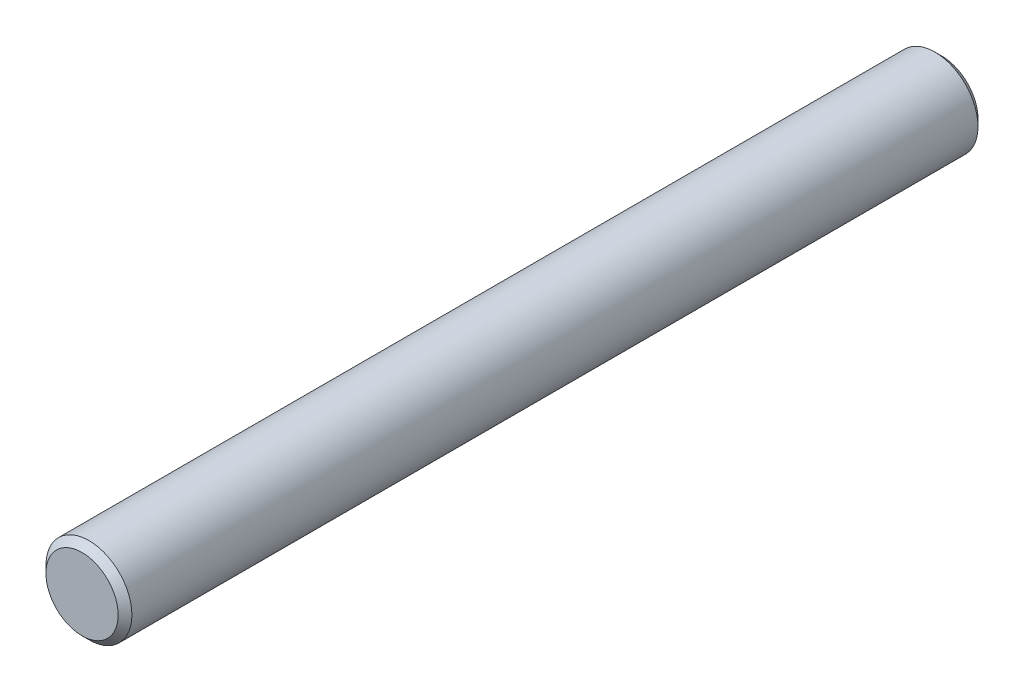
ISO-10303-21;
HEADER;
FILE_DESCRIPTION(('STEP AP214'),'2;1');
FILE_NAME('part.step','',(''),(''),'','','');
FILE_SCHEMA(('AUTOMOTIVE_DESIGN { 1 0 10303 214 1 1 1 1 }'));
ENDSEC;
DATA;
#1=APPLICATION_CONTEXT('core data for automotive mechanical design processes');
#2=APPLICATION_PROTOCOL_DEFINITION('international standard','automotive_design',2000,#1);
#3=PRODUCT_CONTEXT('',#1,'mechanical');
#4=PRODUCT('Part','Part','',(#3));
#5=PRODUCT_RELATED_PRODUCT_CATEGORY('part','',(#4));
#6=PRODUCT_DEFINITION_FORMATION('','',#4);
#7=PRODUCT_DEFINITION_CONTEXT('part definition',#1,'design');
#8=PRODUCT_DEFINITION('design','',#6,#7);
#9=PRODUCT_DEFINITION_SHAPE('','',#8);
#10=(LENGTH_UNIT() NAMED_UNIT(*) SI_UNIT(.MILLI.,.METRE.));
#11=(NAMED_UNIT(*) PLANE_ANGLE_UNIT() SI_UNIT($,.RADIAN.));
#12=(NAMED_UNIT(*) SI_UNIT($,.STERADIAN.) SOLID_ANGLE_UNIT());
#13=UNCERTAINTY_MEASURE_WITH_UNIT(LENGTH_MEASURE(1.E-05),#10,'distance_accuracy_value','');
#14=(GEOMETRIC_REPRESENTATION_CONTEXT(3) GLOBAL_UNCERTAINTY_ASSIGNED_CONTEXT((#13)) GLOBAL_UNIT_ASSIGNED_CONTEXT((#10,
#11,#12)) REPRESENTATION_CONTEXT('',''));
#15=CARTESIAN_POINT('',(0.,0.,0.));
#16=DIRECTION('',(0.,0.,1.));
#17=DIRECTION('',(1.,0.,0.));
#18=AXIS2_PLACEMENT_3D('',#15,#16,#17);
#19=CARTESIAN_POINT('',(0.,0.,15.875));
#20=DIRECTION('',(0.,0.,-1.));
#21=DIRECTION('',(-1.,0.,0.));
#22=AXIS2_PLACEMENT_3D('',#19,#20,#21);
#23=CYLINDRICAL_SURFACE('',#22,1.5875);
#24=CARTESIAN_POINT('',(0.,0.,-15.621));
#25=DIRECTION('',(0.,0.,1.));
#26=DIRECTION('',(1.,0.,0.));
#27=AXIS2_PLACEMENT_3D('',#24,#25,#26);
#28=CIRCLE('',#27,1.5875);
#29=CARTESIAN_POINT('',(1.5875,0.,-15.621));
#30=VERTEX_POINT('',#29);
#31=EDGE_CURVE('E41',#30,#30,#28,.T.);
#32=ORIENTED_EDGE('',*,*,#31,.T.);
#33=EDGE_LOOP('',(#32));
#34=FACE_BOUND('',#33,.T.);
#35=CARTESIAN_POINT('',(0.,0.,15.621));
#36=DIRECTION('',(0.,0.,1.));
#37=DIRECTION('',(1.,0.,0.));
#38=AXIS2_PLACEMENT_3D('',#35,#36,#37);
#39=CIRCLE('',#38,1.5875);
#40=CARTESIAN_POINT('',(1.5875,0.,15.621));
#41=VERTEX_POINT('',#40);
#42=EDGE_CURVE('E45',#41,#41,#39,.F.);
#43=ORIENTED_EDGE('',*,*,#42,.T.);
#44=EDGE_LOOP('',(#43));
#45=FACE_BOUND('',#44,.T.);
#46=ADVANCED_FACE('F30',(#34,#45),#23,.T.);
#47=CARTESIAN_POINT('',(0.,0.,15.875));
#48=DIRECTION('',(0.,0.,1.));
#49=DIRECTION('',(1.,0.,0.));
#50=AXIS2_PLACEMENT_3D('',#47,#48,#49);
#51=PLANE('',#50);
#52=CARTESIAN_POINT('',(0.,0.,15.875));
#53=DIRECTION('',(0.,0.,1.));
#54=DIRECTION('',(1.,0.,0.));
#55=AXIS2_PLACEMENT_3D('',#52,#53,#54);
#56=CIRCLE('',#55,1.3335);
#57=CARTESIAN_POINT('',(1.3335,0.,15.875));
#58=VERTEX_POINT('',#57);
#59=EDGE_CURVE('E10',#58,#58,#56,.T.);
#60=ORIENTED_EDGE('',*,*,#59,.T.);
#61=EDGE_LOOP('',(#60));
#62=FACE_BOUND('',#61,.T.);
#63=ADVANCED_FACE('F61',(#62),#51,.T.);
#64=CARTESIAN_POINT('',(0.,0.,-15.875));
#65=DIRECTION('',(0.,0.,1.));
#66=DIRECTION('',(1.,0.,0.));
#67=AXIS2_PLACEMENT_3D('',#64,#65,#66);
#68=PLANE('',#67);
#69=CARTESIAN_POINT('',(0.,0.,-15.875));
#70=DIRECTION('',(0.,0.,1.));
#71=DIRECTION('',(1.,0.,0.));
#72=AXIS2_PLACEMENT_3D('',#69,#70,#71);
#73=CIRCLE('',#72,1.33350000000001);
#74=CARTESIAN_POINT('',(1.33350000000001,0.,-15.875));
#75=VERTEX_POINT('',#74);
#76=EDGE_CURVE('E37',#75,#75,#73,.F.);
#77=ORIENTED_EDGE('',*,*,#76,.T.);
#78=EDGE_LOOP('',(#77));
#79=FACE_BOUND('',#78,.T.);
#80=ADVANCED_FACE('F58',(#79),#68,.F.);
#81=CARTESIAN_POINT('',(0.,0.,-15.621));
#82=DIRECTION('',(0.,0.,1.));
#83=DIRECTION('',(1.,0.,0.));
#84=AXIS2_PLACEMENT_3D('',#81,#82,#83);
#85=CONICAL_SURFACE('',#84,1.5875,0.785398163397438);
#86=ORIENTED_EDGE('',*,*,#76,.F.);
#87=EDGE_LOOP('',(#86));
#88=FACE_BOUND('',#87,.T.);
#89=ORIENTED_EDGE('',*,*,#31,.F.);
#90=EDGE_LOOP('',(#89));
#91=FACE_BOUND('',#90,.T.);
#92=ADVANCED_FACE('F54',(#88,#91),#85,.T.);
#93=CARTESIAN_POINT('',(0.,0.,15.875));
#94=DIRECTION('',(0.,0.,-1.));
#95=DIRECTION('',(-1.,0.,0.));
#96=AXIS2_PLACEMENT_3D('',#93,#94,#95);
#97=CONICAL_SURFACE('',#96,1.3335,0.785398163397451);
#98=ORIENTED_EDGE('',*,*,#42,.F.);
#99=EDGE_LOOP('',(#98));
#100=FACE_BOUND('',#99,.T.);
#101=ORIENTED_EDGE('',*,*,#59,.F.);
#102=EDGE_LOOP('',(#101));
#103=FACE_BOUND('',#102,.T.);
#104=ADVANCED_FACE('F32',(#100,#103),#97,.T.);
#105=CLOSED_SHELL('',(#46,#63,#80,#92,#104));
#106=MANIFOLD_SOLID_BREP('B2',#105);
#107=ADVANCED_BREP_SHAPE_REPRESENTATION('',(#18,#106),#14);
#108=SHAPE_DEFINITION_REPRESENTATION(#9,#107);
ENDSEC;
END-ISO-10303-21;
